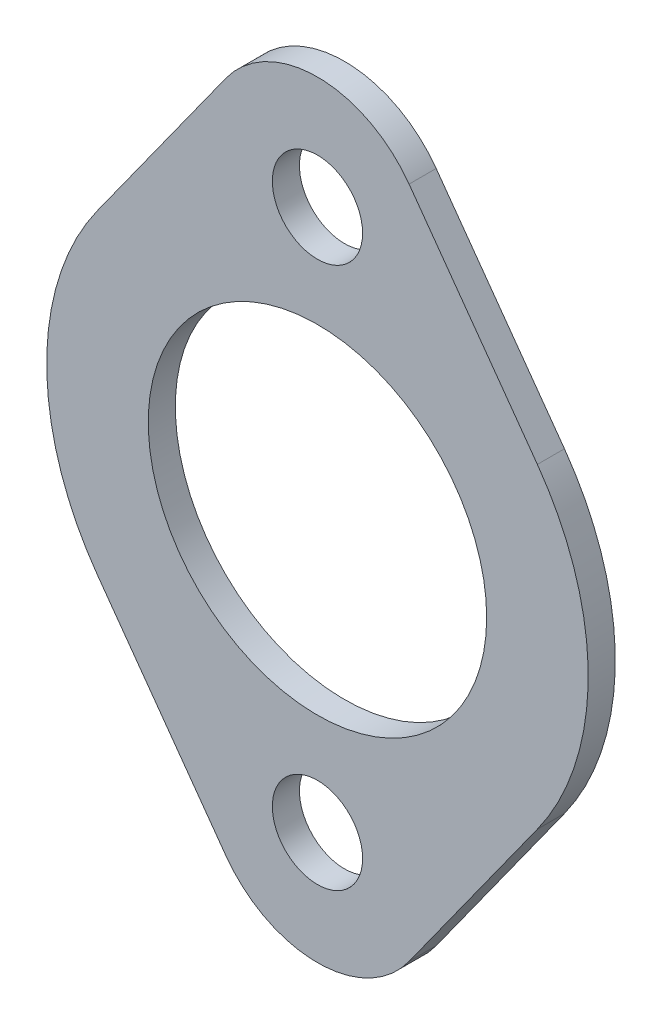
ISO-10303-21;
HEADER;
FILE_DESCRIPTION(('STEP AP214'),'2;1');
FILE_NAME('part.step','',(''),(''),'','','');
FILE_SCHEMA(('AUTOMOTIVE_DESIGN { 1 0 10303 214 1 1 1 1 }'));
ENDSEC;
DATA;
#1=APPLICATION_CONTEXT('core data for automotive mechanical design processes');
#2=APPLICATION_PROTOCOL_DEFINITION('international standard','automotive_design',2000,#1);
#3=PRODUCT_CONTEXT('',#1,'mechanical');
#4=PRODUCT('Part','Part','',(#3));
#5=PRODUCT_RELATED_PRODUCT_CATEGORY('part','',(#4));
#6=PRODUCT_DEFINITION_FORMATION('','',#4);
#7=PRODUCT_DEFINITION_CONTEXT('part definition',#1,'design');
#8=PRODUCT_DEFINITION('design','',#6,#7);
#9=PRODUCT_DEFINITION_SHAPE('','',#8);
#10=(LENGTH_UNIT() NAMED_UNIT(*) SI_UNIT(.MILLI.,.METRE.));
#11=(NAMED_UNIT(*) PLANE_ANGLE_UNIT() SI_UNIT($,.RADIAN.));
#12=(NAMED_UNIT(*) SI_UNIT($,.STERADIAN.) SOLID_ANGLE_UNIT());
#13=UNCERTAINTY_MEASURE_WITH_UNIT(LENGTH_MEASURE(1.E-05),#10,'distance_accuracy_value','');
#14=(GEOMETRIC_REPRESENTATION_CONTEXT(3) GLOBAL_UNCERTAINTY_ASSIGNED_CONTEXT((#13)) GLOBAL_UNIT_ASSIGNED_CONTEXT((#10,
#11,#12)) REPRESENTATION_CONTEXT('',''));
#15=CARTESIAN_POINT('',(0.,0.,0.));
#16=DIRECTION('',(0.,0.,1.));
#17=DIRECTION('',(1.,0.,0.));
#18=AXIS2_PLACEMENT_3D('',#15,#16,#17);
#19=CARTESIAN_POINT('',(0.,38.1,3.81));
#20=DIRECTION('',(0.,0.,-1.));
#21=DIRECTION('',(-1.,0.,0.));
#22=AXIS2_PLACEMENT_3D('',#19,#20,#21);
#23=CYLINDRICAL_SURFACE('',#22,15.875);
#24=CARTESIAN_POINT('',(0.,38.1,0.));
#25=DIRECTION('',(0.,0.,-1.));
#26=DIRECTION('',(-1.,0.,0.));
#27=AXIS2_PLACEMENT_3D('',#24,#25,#26);
#28=CIRCLE('',#27,15.875);
#29=CARTESIAN_POINT('',(-12.8941966853202,47.3604166666667,0.));
#30=VERTEX_POINT('',#29);
#31=CARTESIAN_POINT('',(12.8941966853202,47.3604166666667,0.));
#32=VERTEX_POINT('',#31);
#33=EDGE_CURVE('E131',#30,#32,#28,.T.);
#34=ORIENTED_EDGE('',*,*,#33,.F.);
#35=DIRECTION('',(0.,0.,-1.));
#36=VECTOR('',#35,1.);
#37=CARTESIAN_POINT('',(-12.8941966853202,47.3604166666667,3.81));
#38=LINE('',#37,#36);
#39=CARTESIAN_POINT('',(-12.8941966853202,47.3604166666667,3.81));
#40=VERTEX_POINT('',#39);
#41=EDGE_CURVE('E11',#40,#30,#38,.T.);
#42=ORIENTED_EDGE('',*,*,#41,.F.);
#43=CARTESIAN_POINT('',(0.,38.1,3.81));
#44=DIRECTION('',(0.,0.,-1.));
#45=DIRECTION('',(-1.,0.,0.));
#46=AXIS2_PLACEMENT_3D('',#43,#44,#45);
#47=CIRCLE('',#46,15.875);
#48=CARTESIAN_POINT('',(12.8941966853202,47.3604166666667,3.81));
#49=VERTEX_POINT('',#48);
#50=EDGE_CURVE('E150',#40,#49,#47,.T.);
#51=ORIENTED_EDGE('',*,*,#50,.T.);
#52=DIRECTION('',(0.,0.,-1.));
#53=VECTOR('',#52,1.);
#54=CARTESIAN_POINT('',(12.8941966853202,47.3604166666667,3.81));
#55=LINE('',#54,#53);
#56=EDGE_CURVE('E37',#49,#32,#55,.T.);
#57=ORIENTED_EDGE('',*,*,#56,.T.);
#58=EDGE_LOOP('',(#34,#42,#51,#57));
#59=FACE_BOUND('',#58,.T.);
#60=ADVANCED_FACE('F34',(#59),#23,.T.);
#61=CARTESIAN_POINT('',(-12.8941966853202,47.3604166666667,3.81));
#62=DIRECTION('',(0.812232862067414,-0.583333333333333,0.));
#63=DIRECTION('',(0.583333333333333,0.812232862067414,0.));
#64=AXIS2_PLACEMENT_3D('',#61,#62,#63);
#65=PLANE('',#64);
#66=DIRECTION('',(-0.583333333333333,-0.812232862067414,0.));
#67=VECTOR('',#66,1.);
#68=CARTESIAN_POINT('',(-12.8941966853202,47.3604166666667,0.));
#69=LINE('',#68,#67);
#70=CARTESIAN_POINT('',(-30.9460720447685,22.225,0.));
#71=VERTEX_POINT('',#70);
#72=EDGE_CURVE('E149',#30,#71,#69,.T.);
#73=ORIENTED_EDGE('',*,*,#72,.T.);
#74=DIRECTION('',(0.,0.,-1.));
#75=VECTOR('',#74,1.);
#76=CARTESIAN_POINT('',(-30.9460720447685,22.225,3.81));
#77=LINE('',#76,#75);
#78=CARTESIAN_POINT('',(-30.9460720447685,22.225,3.81));
#79=VERTEX_POINT('',#78);
#80=EDGE_CURVE('E43',#79,#71,#77,.T.);
#81=ORIENTED_EDGE('',*,*,#80,.F.);
#82=DIRECTION('',(-0.583333333333333,-0.812232862067414,0.));
#83=VECTOR('',#82,1.);
#84=CARTESIAN_POINT('',(-12.8941966853202,47.3604166666667,3.81));
#85=LINE('',#84,#83);
#86=EDGE_CURVE('E120',#40,#79,#85,.T.);
#87=ORIENTED_EDGE('',*,*,#86,.F.);
#88=ORIENTED_EDGE('',*,*,#41,.T.);
#89=EDGE_LOOP('',(#73,#81,#87,#88));
#90=FACE_BOUND('',#89,.T.);
#91=ADVANCED_FACE('F163',(#90),#65,.F.);
#92=CARTESIAN_POINT('',(0.,0.,3.81));
#93=DIRECTION('',(0.,0.,-1.));
#94=DIRECTION('',(-1.,0.,0.));
#95=AXIS2_PLACEMENT_3D('',#92,#93,#94);
#96=CYLINDRICAL_SURFACE('',#95,38.1);
#97=CARTESIAN_POINT('',(0.,0.,0.));
#98=DIRECTION('',(0.,0.,-1.));
#99=DIRECTION('',(-1.,0.,0.));
#100=AXIS2_PLACEMENT_3D('',#97,#98,#99);
#101=CIRCLE('',#100,38.1);
#102=CARTESIAN_POINT('',(-30.9460720447684,-22.225,0.));
#103=VERTEX_POINT('',#102);
#104=EDGE_CURVE('E108',#103,#71,#101,.T.);
#105=ORIENTED_EDGE('',*,*,#104,.F.);
#106=DIRECTION('',(0.,0.,-1.));
#107=VECTOR('',#106,1.);
#108=CARTESIAN_POINT('',(-30.9460720447684,-22.225,3.81));
#109=LINE('',#108,#107);
#110=CARTESIAN_POINT('',(-30.9460720447684,-22.225,3.81));
#111=VERTEX_POINT('',#110);
#112=EDGE_CURVE('E103',#111,#103,#109,.T.);
#113=ORIENTED_EDGE('',*,*,#112,.F.);
#114=CARTESIAN_POINT('',(0.,0.,3.81));
#115=DIRECTION('',(0.,0.,-1.));
#116=DIRECTION('',(-1.,0.,0.));
#117=AXIS2_PLACEMENT_3D('',#114,#115,#116);
#118=CIRCLE('',#117,38.1);
#119=EDGE_CURVE('E106',#111,#79,#118,.T.);
#120=ORIENTED_EDGE('',*,*,#119,.T.);
#121=ORIENTED_EDGE('',*,*,#80,.T.);
#122=EDGE_LOOP('',(#105,#113,#120,#121));
#123=FACE_BOUND('',#122,.T.);
#124=ADVANCED_FACE('F105',(#123),#96,.T.);
#125=CARTESIAN_POINT('',(-12.8941966853202,-47.3604166666667,3.81));
#126=DIRECTION('',(-0.812232862067414,-0.583333333333333,0.));
#127=DIRECTION('',(0.583333333333333,-0.812232862067414,0.));
#128=AXIS2_PLACEMENT_3D('',#125,#126,#127);
#129=PLANE('',#128);
#130=DIRECTION('',(-0.583333333333333,0.812232862067414,0.));
#131=VECTOR('',#130,1.);
#132=CARTESIAN_POINT('',(-12.8941966853202,-47.3604166666667,0.));
#133=LINE('',#132,#131);
#134=CARTESIAN_POINT('',(-12.8941966853202,-47.3604166666667,0.));
#135=VERTEX_POINT('',#134);
#136=EDGE_CURVE('E146',#135,#103,#133,.T.);
#137=ORIENTED_EDGE('',*,*,#136,.F.);
#138=DIRECTION('',(0.,0.,-1.));
#139=VECTOR('',#138,1.);
#140=CARTESIAN_POINT('',(-12.8941966853202,-47.3604166666667,3.81));
#141=LINE('',#140,#139);
#142=CARTESIAN_POINT('',(-12.8941966853202,-47.3604166666667,3.81));
#143=VERTEX_POINT('',#142);
#144=EDGE_CURVE('E113',#143,#135,#141,.T.);
#145=ORIENTED_EDGE('',*,*,#144,.F.);
#146=DIRECTION('',(-0.583333333333333,0.812232862067414,0.));
#147=VECTOR('',#146,1.);
#148=CARTESIAN_POINT('',(-12.8941966853202,-47.3604166666667,3.81));
#149=LINE('',#148,#147);
#150=EDGE_CURVE('E119',#143,#111,#149,.T.);
#151=ORIENTED_EDGE('',*,*,#150,.T.);
#152=ORIENTED_EDGE('',*,*,#112,.T.);
#153=EDGE_LOOP('',(#137,#145,#151,#152));
#154=FACE_BOUND('',#153,.T.);
#155=ADVANCED_FACE('F122',(#154),#129,.T.);
#156=CARTESIAN_POINT('',(0.,-38.1,3.81));
#157=DIRECTION('',(0.,0.,-1.));
#158=DIRECTION('',(-1.,0.,0.));
#159=AXIS2_PLACEMENT_3D('',#156,#157,#158);
#160=CYLINDRICAL_SURFACE('',#159,15.875);
#161=CARTESIAN_POINT('',(0.,-38.1,0.));
#162=DIRECTION('',(0.,0.,1.));
#163=DIRECTION('',(1.,0.,0.));
#164=AXIS2_PLACEMENT_3D('',#161,#162,#163);
#165=CIRCLE('',#164,15.875);
#166=CARTESIAN_POINT('',(12.8941966853202,-47.3604166666667,0.));
#167=VERTEX_POINT('',#166);
#168=EDGE_CURVE('E144',#135,#167,#165,.T.);
#169=ORIENTED_EDGE('',*,*,#168,.T.);
#170=DIRECTION('',(0.,0.,-1.));
#171=VECTOR('',#170,1.);
#172=CARTESIAN_POINT('',(12.8941966853202,-47.3604166666667,3.81));
#173=LINE('',#172,#171);
#174=CARTESIAN_POINT('',(12.8941966853202,-47.3604166666667,3.81));
#175=VERTEX_POINT('',#174);
#176=EDGE_CURVE('E154',#175,#167,#173,.T.);
#177=ORIENTED_EDGE('',*,*,#176,.F.);
#178=CARTESIAN_POINT('',(0.,-38.1,3.81));
#179=DIRECTION('',(0.,0.,1.));
#180=DIRECTION('',(1.,0.,0.));
#181=AXIS2_PLACEMENT_3D('',#178,#179,#180);
#182=CIRCLE('',#181,15.875);
#183=EDGE_CURVE('E124',#143,#175,#182,.T.);
#184=ORIENTED_EDGE('',*,*,#183,.F.);
#185=ORIENTED_EDGE('',*,*,#144,.T.);
#186=EDGE_LOOP('',(#169,#177,#184,#185));
#187=FACE_BOUND('',#186,.T.);
#188=ADVANCED_FACE('F184',(#187),#160,.T.);
#189=CARTESIAN_POINT('',(12.8941966853202,-47.3604166666667,3.81));
#190=DIRECTION('',(-0.812232862067414,0.583333333333333,0.));
#191=DIRECTION('',(-0.583333333333333,-0.812232862067414,0.));
#192=AXIS2_PLACEMENT_3D('',#189,#190,#191);
#193=PLANE('',#192);
#194=DIRECTION('',(0.583333333333333,0.812232862067414,0.));
#195=VECTOR('',#194,1.);
#196=CARTESIAN_POINT('',(12.8941966853202,-47.3604166666667,0.));
#197=LINE('',#196,#195);
#198=CARTESIAN_POINT('',(30.9460720447685,-22.225,0.));
#199=VERTEX_POINT('',#198);
#200=EDGE_CURVE('E141',#167,#199,#197,.T.);
#201=ORIENTED_EDGE('',*,*,#200,.T.);
#202=DIRECTION('',(0.,0.,-1.));
#203=VECTOR('',#202,1.);
#204=CARTESIAN_POINT('',(30.9460720447685,-22.225,3.81));
#205=LINE('',#204,#203);
#206=CARTESIAN_POINT('',(30.9460720447685,-22.225,3.81));
#207=VERTEX_POINT('',#206);
#208=EDGE_CURVE('E157',#207,#199,#205,.T.);
#209=ORIENTED_EDGE('',*,*,#208,.F.);
#210=DIRECTION('',(0.583333333333333,0.812232862067414,0.));
#211=VECTOR('',#210,1.);
#212=CARTESIAN_POINT('',(12.8941966853202,-47.3604166666667,3.81));
#213=LINE('',#212,#211);
#214=EDGE_CURVE('E126',#175,#207,#213,.T.);
#215=ORIENTED_EDGE('',*,*,#214,.F.);
#216=ORIENTED_EDGE('',*,*,#176,.T.);
#217=EDGE_LOOP('',(#201,#209,#215,#216));
#218=FACE_BOUND('',#217,.T.);
#219=ADVANCED_FACE('F178',(#218),#193,.F.);
#220=CARTESIAN_POINT('',(0.,0.,3.81));
#221=DIRECTION('',(0.,0.,-1.));
#222=DIRECTION('',(-1.,0.,0.));
#223=AXIS2_PLACEMENT_3D('',#220,#221,#222);
#224=CYLINDRICAL_SURFACE('',#223,38.1);
#225=CARTESIAN_POINT('',(0.,0.,0.));
#226=DIRECTION('',(0.,0.,-1.));
#227=DIRECTION('',(-1.,0.,0.));
#228=AXIS2_PLACEMENT_3D('',#225,#226,#227);
#229=CIRCLE('',#228,38.1);
#230=CARTESIAN_POINT('',(30.9460720447685,22.225,0.));
#231=VERTEX_POINT('',#230);
#232=EDGE_CURVE('E138',#231,#199,#229,.T.);
#233=ORIENTED_EDGE('',*,*,#232,.F.);
#234=DIRECTION('',(0.,0.,-1.));
#235=VECTOR('',#234,1.);
#236=CARTESIAN_POINT('',(30.9460720447685,22.225,3.81));
#237=LINE('',#236,#235);
#238=CARTESIAN_POINT('',(30.9460720447685,22.225,3.81));
#239=VERTEX_POINT('',#238);
#240=EDGE_CURVE('E158',#239,#231,#237,.T.);
#241=ORIENTED_EDGE('',*,*,#240,.F.);
#242=CARTESIAN_POINT('',(0.,0.,3.81));
#243=DIRECTION('',(0.,0.,-1.));
#244=DIRECTION('',(-1.,0.,0.));
#245=AXIS2_PLACEMENT_3D('',#242,#243,#244);
#246=CIRCLE('',#245,38.1);
#247=EDGE_CURVE('E167',#239,#207,#246,.T.);
#248=ORIENTED_EDGE('',*,*,#247,.T.);
#249=ORIENTED_EDGE('',*,*,#208,.T.);
#250=EDGE_LOOP('',(#233,#241,#248,#249));
#251=FACE_BOUND('',#250,.T.);
#252=ADVANCED_FACE('F181',(#251),#224,.T.);
#253=CARTESIAN_POINT('',(12.8941966853202,47.3604166666667,3.81));
#254=DIRECTION('',(0.812232862067414,0.583333333333333,0.));
#255=DIRECTION('',(-0.583333333333333,0.812232862067414,0.));
#256=AXIS2_PLACEMENT_3D('',#253,#254,#255);
#257=PLANE('',#256);
#258=DIRECTION('',(0.583333333333333,-0.812232862067414,0.));
#259=VECTOR('',#258,1.);
#260=CARTESIAN_POINT('',(12.8941966853202,47.3604166666667,0.));
#261=LINE('',#260,#259);
#262=EDGE_CURVE('E134',#32,#231,#261,.T.);
#263=ORIENTED_EDGE('',*,*,#262,.F.);
#264=ORIENTED_EDGE('',*,*,#56,.F.);
#265=DIRECTION('',(0.583333333333333,-0.812232862067414,0.));
#266=VECTOR('',#265,1.);
#267=CARTESIAN_POINT('',(12.8941966853202,47.3604166666667,3.81));
#268=LINE('',#267,#266);
#269=EDGE_CURVE('E165',#49,#239,#268,.T.);
#270=ORIENTED_EDGE('',*,*,#269,.T.);
#271=ORIENTED_EDGE('',*,*,#240,.T.);
#272=EDGE_LOOP('',(#263,#264,#270,#271));
#273=FACE_BOUND('',#272,.T.);
#274=ADVANCED_FACE('F160',(#273),#257,.T.);
#275=CARTESIAN_POINT('',(0.,38.1,3.81));
#276=DIRECTION('',(0.,0.,-1.));
#277=DIRECTION('',(-1.,0.,0.));
#278=AXIS2_PLACEMENT_3D('',#275,#276,#277);
#279=PLANE('',#278);
#280=CARTESIAN_POINT('',(0.,0.,3.81));
#281=DIRECTION('',(0.,0.,1.));
#282=DIRECTION('',(1.,0.,0.));
#283=AXIS2_PLACEMENT_3D('',#280,#281,#282);
#284=CIRCLE('',#283,23.8125);
#285=CARTESIAN_POINT('',(23.8125,0.,3.81));
#286=VERTEX_POINT('',#285);
#287=EDGE_CURVE('E228',#286,#286,#284,.T.);
#288=ORIENTED_EDGE('',*,*,#287,.F.);
#289=EDGE_LOOP('',(#288));
#290=FACE_BOUND('',#289,.T.);
#291=CARTESIAN_POINT('',(0.,-38.1,3.81));
#292=DIRECTION('',(0.,0.,1.));
#293=DIRECTION('',(1.,0.,0.));
#294=AXIS2_PLACEMENT_3D('',#291,#292,#293);
#295=CIRCLE('',#294,6.35);
#296=CARTESIAN_POINT('',(6.35,-38.1,3.81));
#297=VERTEX_POINT('',#296);
#298=EDGE_CURVE('E230',#297,#297,#295,.T.);
#299=ORIENTED_EDGE('',*,*,#298,.F.);
#300=EDGE_LOOP('',(#299));
#301=FACE_BOUND('',#300,.T.);
#302=CARTESIAN_POINT('',(0.,38.1,3.81));
#303=DIRECTION('',(0.,0.,1.));
#304=DIRECTION('',(1.,0.,0.));
#305=AXIS2_PLACEMENT_3D('',#302,#303,#304);
#306=CIRCLE('',#305,6.35);
#307=CARTESIAN_POINT('',(6.35,38.1,3.81));
#308=VERTEX_POINT('',#307);
#309=EDGE_CURVE('E170',#308,#308,#306,.T.);
#310=ORIENTED_EDGE('',*,*,#309,.F.);
#311=EDGE_LOOP('',(#310));
#312=FACE_BOUND('',#311,.T.);
#313=ORIENTED_EDGE('',*,*,#50,.F.);
#314=ORIENTED_EDGE('',*,*,#86,.T.);
#315=ORIENTED_EDGE('',*,*,#119,.F.);
#316=ORIENTED_EDGE('',*,*,#150,.F.);
#317=ORIENTED_EDGE('',*,*,#183,.T.);
#318=ORIENTED_EDGE('',*,*,#214,.T.);
#319=ORIENTED_EDGE('',*,*,#247,.F.);
#320=ORIENTED_EDGE('',*,*,#269,.F.);
#321=EDGE_LOOP('',(#313,#314,#315,#316,#317,#318,#319,#320));
#322=FACE_BOUND('',#321,.T.);
#323=ADVANCED_FACE('F118',(#290,#301,#312,#322),#279,.F.);
#324=CARTESIAN_POINT('',(0.,38.1,0.));
#325=DIRECTION('',(0.,0.,-1.));
#326=DIRECTION('',(-1.,0.,0.));
#327=AXIS2_PLACEMENT_3D('',#324,#325,#326);
#328=PLANE('',#327);
#329=CARTESIAN_POINT('',(0.,0.,0.));
#330=DIRECTION('',(0.,0.,1.));
#331=DIRECTION('',(1.,0.,0.));
#332=AXIS2_PLACEMENT_3D('',#329,#330,#331);
#333=CIRCLE('',#332,23.8125);
#334=CARTESIAN_POINT('',(23.8125,0.,0.));
#335=VERTEX_POINT('',#334);
#336=EDGE_CURVE('E225',#335,#335,#333,.T.);
#337=ORIENTED_EDGE('',*,*,#336,.T.);
#338=EDGE_LOOP('',(#337));
#339=FACE_BOUND('',#338,.T.);
#340=CARTESIAN_POINT('',(0.,-38.1,0.));
#341=DIRECTION('',(0.,0.,1.));
#342=DIRECTION('',(1.,0.,0.));
#343=AXIS2_PLACEMENT_3D('',#340,#341,#342);
#344=CIRCLE('',#343,6.35);
#345=CARTESIAN_POINT('',(6.35,-38.1,0.));
#346=VERTEX_POINT('',#345);
#347=EDGE_CURVE('E233',#346,#346,#344,.T.);
#348=ORIENTED_EDGE('',*,*,#347,.T.);
#349=EDGE_LOOP('',(#348));
#350=FACE_BOUND('',#349,.T.);
#351=CARTESIAN_POINT('',(0.,38.1,0.));
#352=DIRECTION('',(0.,0.,1.));
#353=DIRECTION('',(1.,0.,0.));
#354=AXIS2_PLACEMENT_3D('',#351,#352,#353);
#355=CIRCLE('',#354,6.35);
#356=CARTESIAN_POINT('',(6.35,38.1,0.));
#357=VERTEX_POINT('',#356);
#358=EDGE_CURVE('E135',#357,#357,#355,.T.);
#359=ORIENTED_EDGE('',*,*,#358,.T.);
#360=EDGE_LOOP('',(#359));
#361=FACE_BOUND('',#360,.T.);
#362=ORIENTED_EDGE('',*,*,#33,.T.);
#363=ORIENTED_EDGE('',*,*,#262,.T.);
#364=ORIENTED_EDGE('',*,*,#232,.T.);
#365=ORIENTED_EDGE('',*,*,#200,.F.);
#366=ORIENTED_EDGE('',*,*,#168,.F.);
#367=ORIENTED_EDGE('',*,*,#136,.T.);
#368=ORIENTED_EDGE('',*,*,#104,.T.);
#369=ORIENTED_EDGE('',*,*,#72,.F.);
#370=EDGE_LOOP('',(#362,#363,#364,#365,#366,#367,#368,#369));
#371=FACE_BOUND('',#370,.T.);
#372=ADVANCED_FACE('F162',(#339,#350,#361,#371),#328,.T.);
#373=CARTESIAN_POINT('',(0.,38.1,0.));
#374=DIRECTION('',(0.,0.,1.));
#375=DIRECTION('',(1.,0.,0.));
#376=AXIS2_PLACEMENT_3D('',#373,#374,#375);
#377=CYLINDRICAL_SURFACE('',#376,6.35);
#378=CARTESIAN_POINT('',(6.35,38.1,0.));
#379=CARTESIAN_POINT('',(6.35,38.1,0.0396874999999999));
#380=CARTESIAN_POINT('',(6.35,38.1,0.079375));
#381=CARTESIAN_POINT('',(6.35,38.1,0.15875));
#382=CARTESIAN_POINT('',(6.35,38.1,0.1984375));
#383=CARTESIAN_POINT('',(6.35,38.1,0.2778125));
#384=CARTESIAN_POINT('',(6.35,38.1,0.3175));
#385=CARTESIAN_POINT('',(6.35,38.1,0.396875));
#386=CARTESIAN_POINT('',(6.35,38.1,0.4365625));
#387=CARTESIAN_POINT('',(6.35,38.1,0.5159375));
#388=CARTESIAN_POINT('',(6.35,38.1,0.555625));
#389=CARTESIAN_POINT('',(6.35,38.1,0.635));
#390=CARTESIAN_POINT('',(6.35,38.1,0.6746875));
#391=CARTESIAN_POINT('',(6.35,38.1,0.7540625));
#392=CARTESIAN_POINT('',(6.35,38.1,0.79375));
#393=CARTESIAN_POINT('',(6.35,38.1,0.873125));
#394=CARTESIAN_POINT('',(6.35,38.1,0.9128125));
#395=CARTESIAN_POINT('',(6.35,38.1,0.9921875));
#396=CARTESIAN_POINT('',(6.35,38.1,1.031875));
#397=CARTESIAN_POINT('',(6.35,38.1,1.11125));
#398=CARTESIAN_POINT('',(6.35,38.1,1.1509375));
#399=CARTESIAN_POINT('',(6.35,38.1,1.2303125));
#400=CARTESIAN_POINT('',(6.35,38.1,1.27));
#401=CARTESIAN_POINT('',(6.35,38.1,1.349375));
#402=CARTESIAN_POINT('',(6.35,38.1,1.3890625));
#403=CARTESIAN_POINT('',(6.35,38.1,1.4684375));
#404=CARTESIAN_POINT('',(6.35,38.1,1.508125));
#405=CARTESIAN_POINT('',(6.35,38.1,1.5875));
#406=CARTESIAN_POINT('',(6.35,38.1,1.6271875));
#407=CARTESIAN_POINT('',(6.35,38.1,1.7065625));
#408=CARTESIAN_POINT('',(6.35,38.1,1.74625));
#409=CARTESIAN_POINT('',(6.35,38.1,1.825625));
#410=CARTESIAN_POINT('',(6.35,38.1,1.8653125));
#411=CARTESIAN_POINT('',(6.35,38.1,1.9446875));
#412=CARTESIAN_POINT('',(6.35,38.1,1.984375));
#413=CARTESIAN_POINT('',(6.35,38.1,2.06375));
#414=CARTESIAN_POINT('',(6.35,38.1,2.1034375));
#415=CARTESIAN_POINT('',(6.35,38.1,2.1828125));
#416=CARTESIAN_POINT('',(6.35,38.1,2.2225));
#417=CARTESIAN_POINT('',(6.35,38.1,2.301875));
#418=CARTESIAN_POINT('',(6.35,38.1,2.3415625));
#419=CARTESIAN_POINT('',(6.35,38.1,2.4209375));
#420=CARTESIAN_POINT('',(6.35,38.1,2.460625));
#421=CARTESIAN_POINT('',(6.35,38.1,2.54));
#422=CARTESIAN_POINT('',(6.35,38.1,2.5796875));
#423=CARTESIAN_POINT('',(6.35,38.1,2.6590625));
#424=CARTESIAN_POINT('',(6.35,38.1,2.69875));
#425=CARTESIAN_POINT('',(6.35,38.1,2.778125));
#426=CARTESIAN_POINT('',(6.35,38.1,2.8178125));
#427=CARTESIAN_POINT('',(6.35,38.1,2.8971875));
#428=CARTESIAN_POINT('',(6.35,38.1,2.936875));
#429=CARTESIAN_POINT('',(6.35,38.1,3.01625));
#430=CARTESIAN_POINT('',(6.35,38.1,3.0559375));
#431=CARTESIAN_POINT('',(6.35,38.1,3.1353125));
#432=CARTESIAN_POINT('',(6.35,38.1,3.175));
#433=CARTESIAN_POINT('',(6.35,38.1,3.254375));
#434=CARTESIAN_POINT('',(6.35,38.1,3.2940625));
#435=CARTESIAN_POINT('',(6.35,38.1,3.3734375));
#436=CARTESIAN_POINT('',(6.35,38.1,3.413125));
#437=CARTESIAN_POINT('',(6.35,38.1,3.4925));
#438=CARTESIAN_POINT('',(6.35,38.1,3.5321875));
#439=CARTESIAN_POINT('',(6.35,38.1,3.6115625));
#440=CARTESIAN_POINT('',(6.35,38.1,3.65125));
#441=CARTESIAN_POINT('',(6.35,38.1,3.730625));
#442=CARTESIAN_POINT('',(6.35,38.1,3.7703125));
#443=CARTESIAN_POINT('',(6.35,38.1,3.81));
#444=B_SPLINE_CURVE_WITH_KNOTS('',3,(#378,#379,#380,#381,#382,#383,#384,#385,#386,#387,#388,
#389,#390,#391,#392,#393,#394,#395,#396,#397,#398,#399,#400,#401,#402,#403,#404,#405,#406,#407,
#408,#409,#410,#411,#412,#413,#414,#415,#416,#417,#418,#419,#420,#421,#422,#423,#424,#425,#426,
#427,#428,#429,#430,#431,#432,#433,#434,#435,#436,#437,#438,#439,#440,#441,#442,#443),
.UNSPECIFIED.,.F.,.F.,(4,2,2,2,2,2,2,2,2,2,2,2,2,2,2,2,2,2,2,2,2,2,2,2,2,2,2,2,2,2,2,2,4),(0.,
0.1190625,0.238125,0.3571875,0.47625,0.5953125,0.714375,0.8334375,0.9525,1.0715625,1.190625,
1.3096875,1.42875,1.5478125,1.666875,1.7859375,1.905,2.0240625,2.143125,2.2621875,2.38125,
2.5003125,2.619375,2.7384375,2.8575,2.9765625,3.095625,3.2146875,3.33375,3.4528125,3.571875,
3.6909375,3.81),.UNSPECIFIED.);
#445=EDGE_CURVE('BSEAM205',#357,#308,#444,.T.);
#446=ORIENTED_EDGE('',*,*,#358,.F.);
#447=ORIENTED_EDGE('',*,*,#309,.T.);
#448=ORIENTED_EDGE('',*,*,#445,.T.);
#449=ORIENTED_EDGE('',*,*,#445,.F.);
#450=EDGE_LOOP('',(#446,#448,#447,#449));
#451=FACE_BOUND('',#450,.T.);
#452=ADVANCED_FACE('F205',(#451),#377,.F.);
#453=CARTESIAN_POINT('',(0.,-38.1,0.));
#454=DIRECTION('',(0.,0.,1.));
#455=DIRECTION('',(1.,0.,0.));
#456=AXIS2_PLACEMENT_3D('',#453,#454,#455);
#457=CYLINDRICAL_SURFACE('',#456,6.35);
#458=CARTESIAN_POINT('',(6.35,-38.1,0.));
#459=CARTESIAN_POINT('',(6.35,-38.1,0.0396874999999999));
#460=CARTESIAN_POINT('',(6.35,-38.1,0.079375));
#461=CARTESIAN_POINT('',(6.35,-38.1,0.15875));
#462=CARTESIAN_POINT('',(6.35,-38.1,0.1984375));
#463=CARTESIAN_POINT('',(6.35,-38.1,0.2778125));
#464=CARTESIAN_POINT('',(6.35,-38.1,0.3175));
#465=CARTESIAN_POINT('',(6.35,-38.1,0.396875));
#466=CARTESIAN_POINT('',(6.35,-38.1,0.4365625));
#467=CARTESIAN_POINT('',(6.35,-38.1,0.5159375));
#468=CARTESIAN_POINT('',(6.35,-38.1,0.555625));
#469=CARTESIAN_POINT('',(6.35,-38.1,0.635));
#470=CARTESIAN_POINT('',(6.35,-38.1,0.6746875));
#471=CARTESIAN_POINT('',(6.35,-38.1,0.7540625));
#472=CARTESIAN_POINT('',(6.35,-38.1,0.79375));
#473=CARTESIAN_POINT('',(6.35,-38.1,0.873125));
#474=CARTESIAN_POINT('',(6.35,-38.1,0.9128125));
#475=CARTESIAN_POINT('',(6.35,-38.1,0.9921875));
#476=CARTESIAN_POINT('',(6.35,-38.1,1.031875));
#477=CARTESIAN_POINT('',(6.35,-38.1,1.11125));
#478=CARTESIAN_POINT('',(6.35,-38.1,1.1509375));
#479=CARTESIAN_POINT('',(6.35,-38.1,1.2303125));
#480=CARTESIAN_POINT('',(6.35,-38.1,1.27));
#481=CARTESIAN_POINT('',(6.35,-38.1,1.349375));
#482=CARTESIAN_POINT('',(6.35,-38.1,1.3890625));
#483=CARTESIAN_POINT('',(6.35,-38.1,1.4684375));
#484=CARTESIAN_POINT('',(6.35,-38.1,1.508125));
#485=CARTESIAN_POINT('',(6.35,-38.1,1.5875));
#486=CARTESIAN_POINT('',(6.35,-38.1,1.6271875));
#487=CARTESIAN_POINT('',(6.35,-38.1,1.7065625));
#488=CARTESIAN_POINT('',(6.35,-38.1,1.74625));
#489=CARTESIAN_POINT('',(6.35,-38.1,1.825625));
#490=CARTESIAN_POINT('',(6.35,-38.1,1.8653125));
#491=CARTESIAN_POINT('',(6.35,-38.1,1.9446875));
#492=CARTESIAN_POINT('',(6.35,-38.1,1.984375));
#493=CARTESIAN_POINT('',(6.35,-38.1,2.06375));
#494=CARTESIAN_POINT('',(6.35,-38.1,2.1034375));
#495=CARTESIAN_POINT('',(6.35,-38.1,2.1828125));
#496=CARTESIAN_POINT('',(6.35,-38.1,2.2225));
#497=CARTESIAN_POINT('',(6.35,-38.1,2.301875));
#498=CARTESIAN_POINT('',(6.35,-38.1,2.3415625));
#499=CARTESIAN_POINT('',(6.35,-38.1,2.4209375));
#500=CARTESIAN_POINT('',(6.35,-38.1,2.460625));
#501=CARTESIAN_POINT('',(6.35,-38.1,2.54));
#502=CARTESIAN_POINT('',(6.35,-38.1,2.5796875));
#503=CARTESIAN_POINT('',(6.35,-38.1,2.6590625));
#504=CARTESIAN_POINT('',(6.35,-38.1,2.69875));
#505=CARTESIAN_POINT('',(6.35,-38.1,2.778125));
#506=CARTESIAN_POINT('',(6.35,-38.1,2.8178125));
#507=CARTESIAN_POINT('',(6.35,-38.1,2.8971875));
#508=CARTESIAN_POINT('',(6.35,-38.1,2.936875));
#509=CARTESIAN_POINT('',(6.35,-38.1,3.01625));
#510=CARTESIAN_POINT('',(6.35,-38.1,3.0559375));
#511=CARTESIAN_POINT('',(6.35,-38.1,3.1353125));
#512=CARTESIAN_POINT('',(6.35,-38.1,3.175));
#513=CARTESIAN_POINT('',(6.35,-38.1,3.254375));
#514=CARTESIAN_POINT('',(6.35,-38.1,3.2940625));
#515=CARTESIAN_POINT('',(6.35,-38.1,3.3734375));
#516=CARTESIAN_POINT('',(6.35,-38.1,3.413125));
#517=CARTESIAN_POINT('',(6.35,-38.1,3.4925));
#518=CARTESIAN_POINT('',(6.35,-38.1,3.5321875));
#519=CARTESIAN_POINT('',(6.35,-38.1,3.6115625));
#520=CARTESIAN_POINT('',(6.35,-38.1,3.65125));
#521=CARTESIAN_POINT('',(6.35,-38.1,3.730625));
#522=CARTESIAN_POINT('',(6.35,-38.1,3.7703125));
#523=CARTESIAN_POINT('',(6.35,-38.1,3.81));
#524=B_SPLINE_CURVE_WITH_KNOTS('',3,(#458,#459,#460,#461,#462,#463,#464,#465,#466,#467,#468,
#469,#470,#471,#472,#473,#474,#475,#476,#477,#478,#479,#480,#481,#482,#483,#484,#485,#486,#487,
#488,#489,#490,#491,#492,#493,#494,#495,#496,#497,#498,#499,#500,#501,#502,#503,#504,#505,#506,
#507,#508,#509,#510,#511,#512,#513,#514,#515,#516,#517,#518,#519,#520,#521,#522,#523),
.UNSPECIFIED.,.F.,.F.,(4,2,2,2,2,2,2,2,2,2,2,2,2,2,2,2,2,2,2,2,2,2,2,2,2,2,2,2,2,2,2,2,4),(0.,
0.1190625,0.238125,0.3571875,0.47625,0.5953125,0.714375,0.8334375,0.9525,1.0715625,1.190625,
1.3096875,1.42875,1.5478125,1.666875,1.7859375,1.905,2.0240625,2.143125,2.2621875,2.38125,
2.5003125,2.619375,2.7384375,2.8575,2.9765625,3.095625,3.2146875,3.33375,3.4528125,3.571875,
3.6909375,3.81),.UNSPECIFIED.);
#525=EDGE_CURVE('BSEAM212',#346,#297,#524,.T.);
#526=ORIENTED_EDGE('',*,*,#347,.F.);
#527=ORIENTED_EDGE('',*,*,#298,.T.);
#528=ORIENTED_EDGE('',*,*,#525,.T.);
#529=ORIENTED_EDGE('',*,*,#525,.F.);
#530=EDGE_LOOP('',(#526,#528,#527,#529));
#531=FACE_BOUND('',#530,.T.);
#532=ADVANCED_FACE('F212',(#531),#457,.F.);
#533=CARTESIAN_POINT('',(0.,0.,0.));
#534=DIRECTION('',(0.,0.,1.));
#535=DIRECTION('',(1.,0.,0.));
#536=AXIS2_PLACEMENT_3D('',#533,#534,#535);
#537=CYLINDRICAL_SURFACE('',#536,23.8125);
#538=CARTESIAN_POINT('',(23.8125,0.,0.));
#539=CARTESIAN_POINT('',(23.8125,0.,0.0396874999999999));
#540=CARTESIAN_POINT('',(23.8125,0.,0.079375));
#541=CARTESIAN_POINT('',(23.8125,0.,0.15875));
#542=CARTESIAN_POINT('',(23.8125,0.,0.1984375));
#543=CARTESIAN_POINT('',(23.8125,0.,0.2778125));
#544=CARTESIAN_POINT('',(23.8125,0.,0.3175));
#545=CARTESIAN_POINT('',(23.8125,0.,0.396875));
#546=CARTESIAN_POINT('',(23.8125,0.,0.4365625));
#547=CARTESIAN_POINT('',(23.8125,0.,0.5159375));
#548=CARTESIAN_POINT('',(23.8125,0.,0.555625));
#549=CARTESIAN_POINT('',(23.8125,0.,0.635));
#550=CARTESIAN_POINT('',(23.8125,0.,0.6746875));
#551=CARTESIAN_POINT('',(23.8125,0.,0.7540625));
#552=CARTESIAN_POINT('',(23.8125,0.,0.79375));
#553=CARTESIAN_POINT('',(23.8125,0.,0.873125));
#554=CARTESIAN_POINT('',(23.8125,0.,0.9128125));
#555=CARTESIAN_POINT('',(23.8125,0.,0.9921875));
#556=CARTESIAN_POINT('',(23.8125,0.,1.031875));
#557=CARTESIAN_POINT('',(23.8125,0.,1.11125));
#558=CARTESIAN_POINT('',(23.8125,0.,1.1509375));
#559=CARTESIAN_POINT('',(23.8125,0.,1.2303125));
#560=CARTESIAN_POINT('',(23.8125,0.,1.27));
#561=CARTESIAN_POINT('',(23.8125,0.,1.349375));
#562=CARTESIAN_POINT('',(23.8125,0.,1.3890625));
#563=CARTESIAN_POINT('',(23.8125,0.,1.4684375));
#564=CARTESIAN_POINT('',(23.8125,0.,1.508125));
#565=CARTESIAN_POINT('',(23.8125,0.,1.5875));
#566=CARTESIAN_POINT('',(23.8125,0.,1.6271875));
#567=CARTESIAN_POINT('',(23.8125,0.,1.7065625));
#568=CARTESIAN_POINT('',(23.8125,0.,1.74625));
#569=CARTESIAN_POINT('',(23.8125,0.,1.825625));
#570=CARTESIAN_POINT('',(23.8125,0.,1.8653125));
#571=CARTESIAN_POINT('',(23.8125,0.,1.9446875));
#572=CARTESIAN_POINT('',(23.8125,0.,1.984375));
#573=CARTESIAN_POINT('',(23.8125,0.,2.06375));
#574=CARTESIAN_POINT('',(23.8125,0.,2.1034375));
#575=CARTESIAN_POINT('',(23.8125,0.,2.1828125));
#576=CARTESIAN_POINT('',(23.8125,0.,2.2225));
#577=CARTESIAN_POINT('',(23.8125,0.,2.301875));
#578=CARTESIAN_POINT('',(23.8125,0.,2.3415625));
#579=CARTESIAN_POINT('',(23.8125,0.,2.4209375));
#580=CARTESIAN_POINT('',(23.8125,0.,2.460625));
#581=CARTESIAN_POINT('',(23.8125,0.,2.54));
#582=CARTESIAN_POINT('',(23.8125,0.,2.5796875));
#583=CARTESIAN_POINT('',(23.8125,0.,2.6590625));
#584=CARTESIAN_POINT('',(23.8125,0.,2.69875));
#585=CARTESIAN_POINT('',(23.8125,0.,2.778125));
#586=CARTESIAN_POINT('',(23.8125,0.,2.8178125));
#587=CARTESIAN_POINT('',(23.8125,0.,2.8971875));
#588=CARTESIAN_POINT('',(23.8125,0.,2.936875));
#589=CARTESIAN_POINT('',(23.8125,0.,3.01625));
#590=CARTESIAN_POINT('',(23.8125,0.,3.0559375));
#591=CARTESIAN_POINT('',(23.8125,0.,3.1353125));
#592=CARTESIAN_POINT('',(23.8125,0.,3.175));
#593=CARTESIAN_POINT('',(23.8125,0.,3.254375));
#594=CARTESIAN_POINT('',(23.8125,0.,3.2940625));
#595=CARTESIAN_POINT('',(23.8125,0.,3.3734375));
#596=CARTESIAN_POINT('',(23.8125,0.,3.413125));
#597=CARTESIAN_POINT('',(23.8125,0.,3.4925));
#598=CARTESIAN_POINT('',(23.8125,0.,3.5321875));
#599=CARTESIAN_POINT('',(23.8125,0.,3.6115625));
#600=CARTESIAN_POINT('',(23.8125,0.,3.65125));
#601=CARTESIAN_POINT('',(23.8125,0.,3.730625));
#602=CARTESIAN_POINT('',(23.8125,0.,3.7703125));
#603=CARTESIAN_POINT('',(23.8125,0.,3.81));
#604=B_SPLINE_CURVE_WITH_KNOTS('',3,(#538,#539,#540,#541,#542,#543,#544,#545,#546,#547,#548,
#549,#550,#551,#552,#553,#554,#555,#556,#557,#558,#559,#560,#561,#562,#563,#564,#565,#566,#567,
#568,#569,#570,#571,#572,#573,#574,#575,#576,#577,#578,#579,#580,#581,#582,#583,#584,#585,#586,
#587,#588,#589,#590,#591,#592,#593,#594,#595,#596,#597,#598,#599,#600,#601,#602,#603),
.UNSPECIFIED.,.F.,.F.,(4,2,2,2,2,2,2,2,2,2,2,2,2,2,2,2,2,2,2,2,2,2,2,2,2,2,2,2,2,2,2,2,4),(0.,
0.1190625,0.238125,0.3571875,0.47625,0.5953125,0.714375,0.8334375,0.9525,1.0715625,1.190625,
1.3096875,1.42875,1.5478125,1.666875,1.7859375,1.905,2.0240625,2.143125,2.2621875,2.38125,
2.5003125,2.619375,2.7384375,2.8575,2.9765625,3.095625,3.2146875,3.33375,3.4528125,3.571875,
3.6909375,3.81),.UNSPECIFIED.);
#605=EDGE_CURVE('BSEAM216',#335,#286,#604,.T.);
#606=ORIENTED_EDGE('',*,*,#336,.F.);
#607=ORIENTED_EDGE('',*,*,#287,.T.);
#608=ORIENTED_EDGE('',*,*,#605,.T.);
#609=ORIENTED_EDGE('',*,*,#605,.F.);
#610=EDGE_LOOP('',(#606,#608,#607,#609));
#611=FACE_BOUND('',#610,.T.);
#612=ADVANCED_FACE('F216',(#611),#537,.F.);
#613=CLOSED_SHELL('',(#60,#91,#124,#155,#188,#219,#252,#274,#323,#372,#452,#532,#612));
#614=MANIFOLD_SOLID_BREP('B2',#613);
#615=ADVANCED_BREP_SHAPE_REPRESENTATION('',(#18,#614),#14);
#616=SHAPE_DEFINITION_REPRESENTATION(#9,#615);
ENDSEC;
END-ISO-10303-21;
